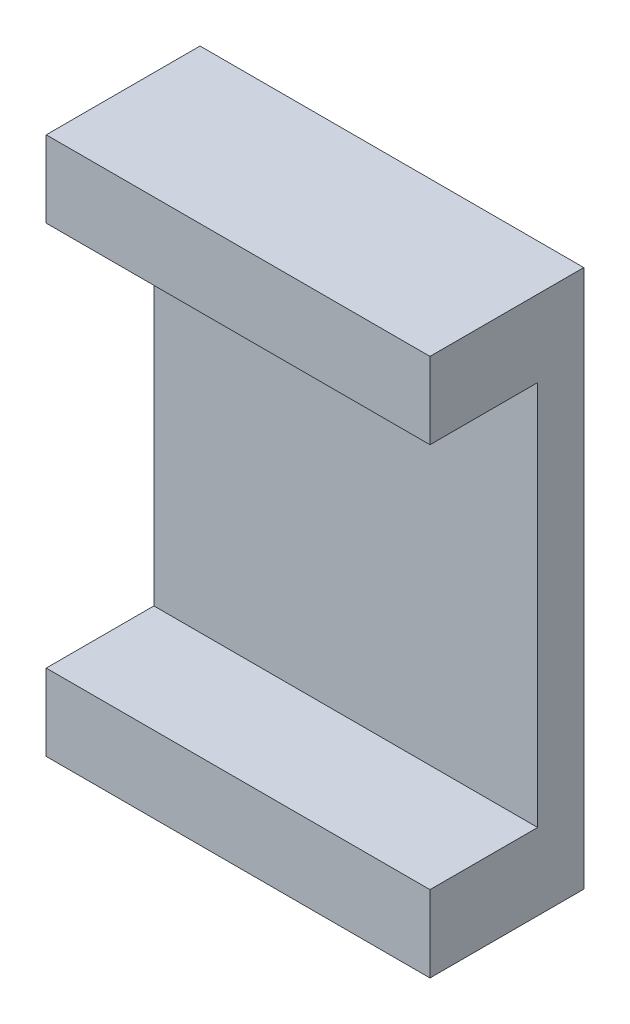
ISO-10303-21;
HEADER;
FILE_DESCRIPTION(('STEP AP214'),'2;1');
FILE_NAME('part.step','',(''),(''),'','','');
FILE_SCHEMA(('AUTOMOTIVE_DESIGN { 1 0 10303 214 1 1 1 1 }'));
ENDSEC;
DATA;
#1=APPLICATION_CONTEXT('core data for automotive mechanical design processes');
#2=APPLICATION_PROTOCOL_DEFINITION('international standard','automotive_design',2000,#1);
#3=PRODUCT_CONTEXT('',#1,'mechanical');
#4=PRODUCT('Part','Part','',(#3));
#5=PRODUCT_RELATED_PRODUCT_CATEGORY('part','',(#4));
#6=PRODUCT_DEFINITION_FORMATION('','',#4);
#7=PRODUCT_DEFINITION_CONTEXT('part definition',#1,'design');
#8=PRODUCT_DEFINITION('design','',#6,#7);
#9=PRODUCT_DEFINITION_SHAPE('','',#8);
#10=(LENGTH_UNIT() NAMED_UNIT(*) SI_UNIT(.MILLI.,.METRE.));
#11=(NAMED_UNIT(*) PLANE_ANGLE_UNIT() SI_UNIT($,.RADIAN.));
#12=(NAMED_UNIT(*) SI_UNIT($,.STERADIAN.) SOLID_ANGLE_UNIT());
#13=UNCERTAINTY_MEASURE_WITH_UNIT(LENGTH_MEASURE(1.E-05),#10,'distance_accuracy_value','');
#14=(GEOMETRIC_REPRESENTATION_CONTEXT(3) GLOBAL_UNCERTAINTY_ASSIGNED_CONTEXT((#13)) GLOBAL_UNIT_ASSIGNED_CONTEXT((#10,
#11,#12)) REPRESENTATION_CONTEXT('',''));
#15=CARTESIAN_POINT('',(0.,0.,0.));
#16=DIRECTION('',(0.,0.,1.));
#17=DIRECTION('',(1.,0.,0.));
#18=AXIS2_PLACEMENT_3D('',#15,#16,#17);
#19=CARTESIAN_POINT('',(0.,0.,10.));
#20=DIRECTION('',(0.,0.,-1.));
#21=DIRECTION('',(-1.,0.,0.));
#22=AXIS2_PLACEMENT_3D('',#19,#20,#21);
#23=PLANE('',#22);
#24=DIRECTION('',(0.,1.,0.));
#25=VECTOR('',#24,1.);
#26=CARTESIAN_POINT('',(12.475,-17.5,10.));
#27=LINE('',#26,#25);
#28=CARTESIAN_POINT('',(12.475,-17.5,10.));
#29=VERTEX_POINT('',#28);
#30=CARTESIAN_POINT('',(12.475,-12.525,10.));
#31=VERTEX_POINT('',#30);
#32=EDGE_CURVE('E131',#29,#31,#27,.T.);
#33=ORIENTED_EDGE('',*,*,#32,.T.);
#34=DIRECTION('',(1.,0.,0.));
#35=VECTOR('',#34,1.);
#36=CARTESIAN_POINT('',(-12.475,-12.525,10.));
#37=LINE('',#36,#35);
#38=CARTESIAN_POINT('',(-12.475,-12.525,10.));
#39=VERTEX_POINT('',#38);
#40=EDGE_CURVE('E122',#39,#31,#37,.T.);
#41=ORIENTED_EDGE('',*,*,#40,.F.);
#42=DIRECTION('',(0.,-1.,0.));
#43=VECTOR('',#42,1.);
#44=CARTESIAN_POINT('',(-12.475,-17.5,10.));
#45=LINE('',#44,#43);
#46=CARTESIAN_POINT('',(-12.475,-17.5,10.));
#47=VERTEX_POINT('',#46);
#48=EDGE_CURVE('E135',#39,#47,#45,.T.);
#49=ORIENTED_EDGE('',*,*,#48,.T.);
#50=DIRECTION('',(1.,0.,0.));
#51=VECTOR('',#50,1.);
#52=CARTESIAN_POINT('',(-12.475,-17.5,10.));
#53=LINE('',#52,#51);
#54=EDGE_CURVE('E56',#47,#29,#53,.T.);
#55=ORIENTED_EDGE('',*,*,#54,.T.);
#56=EDGE_LOOP('',(#33,#41,#49,#55));
#57=FACE_BOUND('',#56,.T.);
#58=ADVANCED_FACE('F32',(#57),#23,.F.);
#59=CARTESIAN_POINT('',(12.475,-17.5,10.));
#60=DIRECTION('',(-1.,0.,0.));
#61=DIRECTION('',(0.,0.,1.));
#62=AXIS2_PLACEMENT_3D('',#59,#60,#61);
#63=PLANE('',#62);
#64=DIRECTION('',(0.,1.,0.));
#65=VECTOR('',#64,1.);
#66=CARTESIAN_POINT('',(12.475,-12.525,3.));
#67=LINE('',#66,#65);
#68=CARTESIAN_POINT('',(12.475,-12.525,3.));
#69=VERTEX_POINT('',#68);
#70=CARTESIAN_POINT('',(12.475,12.525,3.));
#71=VERTEX_POINT('',#70);
#72=EDGE_CURVE('E113',#69,#71,#67,.T.);
#73=ORIENTED_EDGE('',*,*,#72,.F.);
#74=DIRECTION('',(0.,0.,1.));
#75=VECTOR('',#74,1.);
#76=CARTESIAN_POINT('',(12.475,-12.525,3.));
#77=LINE('',#76,#75);
#78=EDGE_CURVE('E145',#69,#31,#77,.T.);
#79=ORIENTED_EDGE('',*,*,#78,.T.);
#80=ORIENTED_EDGE('',*,*,#32,.F.);
#81=DIRECTION('',(0.,0.,-1.));
#82=VECTOR('',#81,1.);
#83=CARTESIAN_POINT('',(12.475,-17.5,10.));
#84=LINE('',#83,#82);
#85=CARTESIAN_POINT('',(12.475,-17.5,0.));
#86=VERTEX_POINT('',#85);
#87=EDGE_CURVE('E140',#29,#86,#84,.T.);
#88=ORIENTED_EDGE('',*,*,#87,.T.);
#89=DIRECTION('',(0.,1.,0.));
#90=VECTOR('',#89,1.);
#91=CARTESIAN_POINT('',(12.475,-17.5,0.));
#92=LINE('',#91,#90);
#93=CARTESIAN_POINT('',(12.475,17.5,0.));
#94=VERTEX_POINT('',#93);
#95=EDGE_CURVE('E141',#86,#94,#92,.T.);
#96=ORIENTED_EDGE('',*,*,#95,.T.);
#97=DIRECTION('',(0.,0.,-1.));
#98=VECTOR('',#97,1.);
#99=CARTESIAN_POINT('',(12.475,17.5,10.));
#100=LINE('',#99,#98);
#101=CARTESIAN_POINT('',(12.475,17.5,10.));
#102=VERTEX_POINT('',#101);
#103=EDGE_CURVE('E11',#102,#94,#100,.T.);
#104=ORIENTED_EDGE('',*,*,#103,.F.);
#105=CARTESIAN_POINT('',(12.475,12.525,10.));
#106=VERTEX_POINT('',#105);
#107=EDGE_CURVE('E84',#106,#102,#27,.T.);
#108=ORIENTED_EDGE('',*,*,#107,.F.);
#109=DIRECTION('',(0.,0.,1.));
#110=VECTOR('',#109,1.);
#111=CARTESIAN_POINT('',(12.475,12.525,3.));
#112=LINE('',#111,#110);
#113=EDGE_CURVE('E47',#71,#106,#112,.T.);
#114=ORIENTED_EDGE('',*,*,#113,.F.);
#115=EDGE_LOOP('',(#73,#79,#80,#88,#96,#104,#108,#114));
#116=FACE_BOUND('',#115,.T.);
#117=ADVANCED_FACE('F34',(#116),#63,.F.);
#118=CARTESIAN_POINT('',(-12.475,17.5,10.));
#119=DIRECTION('',(0.,-1.,0.));
#120=DIRECTION('',(0.,0.,-1.));
#121=AXIS2_PLACEMENT_3D('',#118,#119,#120);
#122=PLANE('',#121);
#123=DIRECTION('',(-1.,0.,0.));
#124=VECTOR('',#123,1.);
#125=CARTESIAN_POINT('',(-12.475,17.5,0.));
#126=LINE('',#125,#124);
#127=CARTESIAN_POINT('',(-12.475,17.5,0.));
#128=VERTEX_POINT('',#127);
#129=EDGE_CURVE('E144',#94,#128,#126,.T.);
#130=ORIENTED_EDGE('',*,*,#129,.T.);
#131=DIRECTION('',(0.,0.,-1.));
#132=VECTOR('',#131,1.);
#133=CARTESIAN_POINT('',(-12.475,17.5,10.));
#134=LINE('',#133,#132);
#135=CARTESIAN_POINT('',(-12.475,17.5,10.));
#136=VERTEX_POINT('',#135);
#137=EDGE_CURVE('E40',#136,#128,#134,.T.);
#138=ORIENTED_EDGE('',*,*,#137,.F.);
#139=DIRECTION('',(-1.,0.,0.));
#140=VECTOR('',#139,1.);
#141=CARTESIAN_POINT('',(-12.475,17.5,10.));
#142=LINE('',#141,#140);
#143=EDGE_CURVE('E133',#102,#136,#142,.T.);
#144=ORIENTED_EDGE('',*,*,#143,.F.);
#145=ORIENTED_EDGE('',*,*,#103,.T.);
#146=EDGE_LOOP('',(#130,#138,#144,#145));
#147=FACE_BOUND('',#146,.T.);
#148=ADVANCED_FACE('F189',(#147),#122,.F.);
#149=CARTESIAN_POINT('',(-12.475,-17.5,10.));
#150=DIRECTION('',(1.,0.,0.));
#151=DIRECTION('',(0.,0.,-1.));
#152=AXIS2_PLACEMENT_3D('',#149,#150,#151);
#153=PLANE('',#152);
#154=ORIENTED_EDGE('',*,*,#48,.F.);
#155=DIRECTION('',(0.,0.,1.));
#156=VECTOR('',#155,1.);
#157=CARTESIAN_POINT('',(-12.475,-12.525,3.));
#158=LINE('',#157,#156);
#159=CARTESIAN_POINT('',(-12.475,-12.525,3.));
#160=VERTEX_POINT('',#159);
#161=EDGE_CURVE('E126',#160,#39,#158,.T.);
#162=ORIENTED_EDGE('',*,*,#161,.F.);
#163=DIRECTION('',(0.,-1.,0.));
#164=VECTOR('',#163,1.);
#165=CARTESIAN_POINT('',(-12.475,-12.525,3.));
#166=LINE('',#165,#164);
#167=CARTESIAN_POINT('',(-12.475,12.525,3.));
#168=VERTEX_POINT('',#167);
#169=EDGE_CURVE('E112',#168,#160,#166,.T.);
#170=ORIENTED_EDGE('',*,*,#169,.F.);
#171=DIRECTION('',(0.,0.,1.));
#172=VECTOR('',#171,1.);
#173=CARTESIAN_POINT('',(-12.475,12.525,3.));
#174=LINE('',#173,#172);
#175=CARTESIAN_POINT('',(-12.475,12.525,10.));
#176=VERTEX_POINT('',#175);
#177=EDGE_CURVE('E109',#168,#176,#174,.T.);
#178=ORIENTED_EDGE('',*,*,#177,.T.);
#179=EDGE_CURVE('E136',#136,#176,#45,.T.);
#180=ORIENTED_EDGE('',*,*,#179,.F.);
#181=ORIENTED_EDGE('',*,*,#137,.T.);
#182=DIRECTION('',(0.,-1.,0.));
#183=VECTOR('',#182,1.);
#184=CARTESIAN_POINT('',(-12.475,-17.5,0.));
#185=LINE('',#184,#183);
#186=CARTESIAN_POINT('',(-12.475,-17.5,0.));
#187=VERTEX_POINT('',#186);
#188=EDGE_CURVE('E147',#128,#187,#185,.T.);
#189=ORIENTED_EDGE('',*,*,#188,.T.);
#190=DIRECTION('',(0.,0.,-1.));
#191=VECTOR('',#190,1.);
#192=CARTESIAN_POINT('',(-12.475,-17.5,10.));
#193=LINE('',#192,#191);
#194=EDGE_CURVE('E151',#47,#187,#193,.T.);
#195=ORIENTED_EDGE('',*,*,#194,.F.);
#196=EDGE_LOOP('',(#154,#162,#170,#178,#180,#181,#189,#195));
#197=FACE_BOUND('',#196,.T.);
#198=ADVANCED_FACE('F158',(#197),#153,.F.);
#199=CARTESIAN_POINT('',(-12.475,-17.5,10.));
#200=DIRECTION('',(0.,1.,0.));
#201=DIRECTION('',(0.,0.,1.));
#202=AXIS2_PLACEMENT_3D('',#199,#200,#201);
#203=PLANE('',#202);
#204=DIRECTION('',(1.,0.,0.));
#205=VECTOR('',#204,1.);
#206=CARTESIAN_POINT('',(-12.475,-17.5,0.));
#207=LINE('',#206,#205);
#208=EDGE_CURVE('E77',#187,#86,#207,.T.);
#209=ORIENTED_EDGE('',*,*,#208,.T.);
#210=ORIENTED_EDGE('',*,*,#87,.F.);
#211=ORIENTED_EDGE('',*,*,#54,.F.);
#212=ORIENTED_EDGE('',*,*,#194,.T.);
#213=EDGE_LOOP('',(#209,#210,#211,#212));
#214=FACE_BOUND('',#213,.T.);
#215=ADVANCED_FACE('F165',(#214),#203,.F.);
#216=ORIENTED_EDGE('',*,*,#179,.T.);
#217=DIRECTION('',(-1.,0.,0.));
#218=VECTOR('',#217,1.);
#219=CARTESIAN_POINT('',(-12.475,12.525,10.));
#220=LINE('',#219,#218);
#221=EDGE_CURVE('E169',#106,#176,#220,.T.);
#222=ORIENTED_EDGE('',*,*,#221,.F.);
#223=ORIENTED_EDGE('',*,*,#107,.T.);
#224=ORIENTED_EDGE('',*,*,#143,.T.);
#225=EDGE_LOOP('',(#216,#222,#223,#224));
#226=FACE_BOUND('',#225,.T.);
#227=ADVANCED_FACE('F181',(#226),#23,.F.);
#228=CARTESIAN_POINT('',(0.,0.,0.));
#229=DIRECTION('',(0.,0.,-1.));
#230=DIRECTION('',(-1.,0.,0.));
#231=AXIS2_PLACEMENT_3D('',#228,#229,#230);
#232=PLANE('',#231);
#233=ORIENTED_EDGE('',*,*,#95,.F.);
#234=ORIENTED_EDGE('',*,*,#208,.F.);
#235=ORIENTED_EDGE('',*,*,#188,.F.);
#236=ORIENTED_EDGE('',*,*,#129,.F.);
#237=EDGE_LOOP('',(#233,#234,#235,#236));
#238=FACE_BOUND('',#237,.T.);
#239=ADVANCED_FACE('F163',(#238),#232,.T.);
#240=CARTESIAN_POINT('',(-12.475,-12.525,3.));
#241=DIRECTION('',(0.,-1.,0.));
#242=DIRECTION('',(0.,0.,-1.));
#243=AXIS2_PLACEMENT_3D('',#240,#241,#242);
#244=PLANE('',#243);
#245=ORIENTED_EDGE('',*,*,#40,.T.);
#246=ORIENTED_EDGE('',*,*,#78,.F.);
#247=DIRECTION('',(1.,0.,0.));
#248=VECTOR('',#247,1.);
#249=CARTESIAN_POINT('',(-12.475,-12.525,3.));
#250=LINE('',#249,#248);
#251=EDGE_CURVE('E119',#160,#69,#250,.T.);
#252=ORIENTED_EDGE('',*,*,#251,.F.);
#253=ORIENTED_EDGE('',*,*,#161,.T.);
#254=EDGE_LOOP('',(#245,#246,#252,#253));
#255=FACE_BOUND('',#254,.T.);
#256=ADVANCED_FACE('F173',(#255),#244,.F.);
#257=CARTESIAN_POINT('',(-12.475,12.525,3.));
#258=DIRECTION('',(0.,1.,0.));
#259=DIRECTION('',(0.,0.,1.));
#260=AXIS2_PLACEMENT_3D('',#257,#258,#259);
#261=PLANE('',#260);
#262=ORIENTED_EDGE('',*,*,#221,.T.);
#263=ORIENTED_EDGE('',*,*,#177,.F.);
#264=DIRECTION('',(-1.,0.,0.));
#265=VECTOR('',#264,1.);
#266=CARTESIAN_POINT('',(-12.475,12.525,3.));
#267=LINE('',#266,#265);
#268=EDGE_CURVE('E105',#71,#168,#267,.T.);
#269=ORIENTED_EDGE('',*,*,#268,.F.);
#270=ORIENTED_EDGE('',*,*,#113,.T.);
#271=EDGE_LOOP('',(#262,#263,#269,#270));
#272=FACE_BOUND('',#271,.T.);
#273=ADVANCED_FACE('F107',(#272),#261,.F.);
#274=CARTESIAN_POINT('',(0.,0.,3.));
#275=DIRECTION('',(0.,0.,-1.));
#276=DIRECTION('',(-1.,0.,0.));
#277=AXIS2_PLACEMENT_3D('',#274,#275,#276);
#278=PLANE('',#277);
#279=ORIENTED_EDGE('',*,*,#72,.T.);
#280=ORIENTED_EDGE('',*,*,#268,.T.);
#281=ORIENTED_EDGE('',*,*,#169,.T.);
#282=ORIENTED_EDGE('',*,*,#251,.T.);
#283=EDGE_LOOP('',(#279,#280,#281,#282));
#284=FACE_BOUND('',#283,.T.);
#285=ADVANCED_FACE('F117',(#284),#278,.F.);
#286=CLOSED_SHELL('',(#58,#117,#148,#198,#215,#227,#239,#256,#273,#285));
#287=MANIFOLD_SOLID_BREP('B2',#286);
#288=ADVANCED_BREP_SHAPE_REPRESENTATION('',(#18,#287),#14);
#289=SHAPE_DEFINITION_REPRESENTATION(#9,#288);
ENDSEC;
END-ISO-10303-21;
